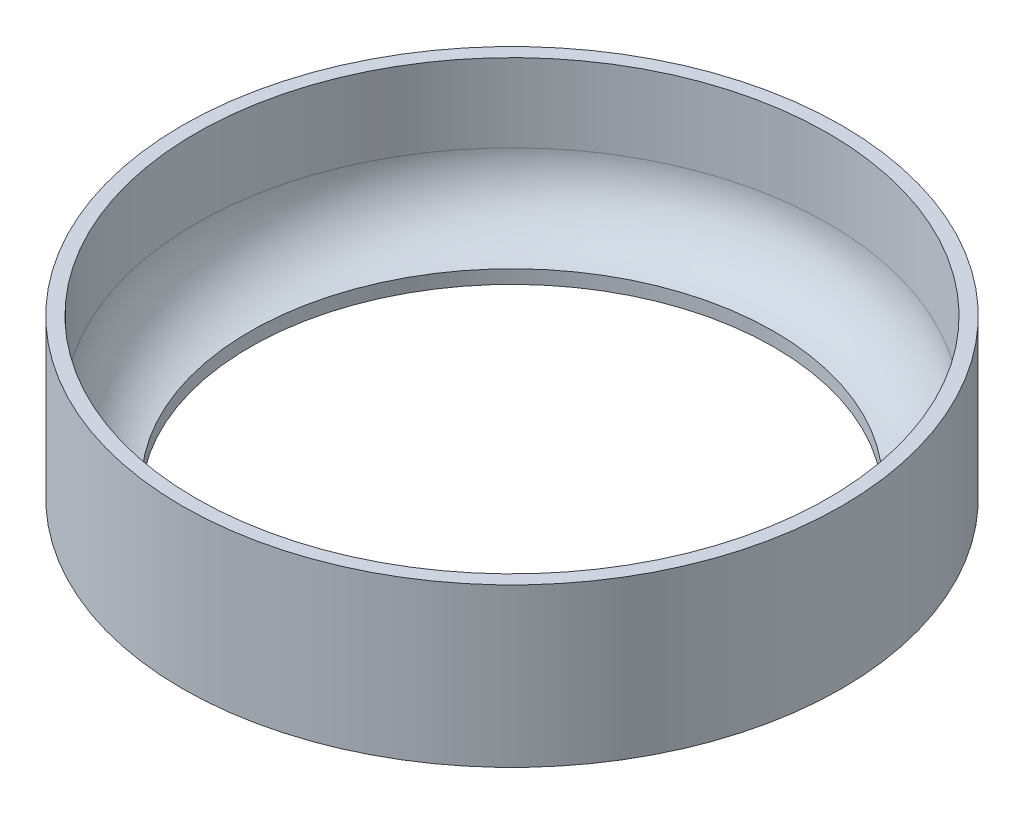
ISO-10303-21;
HEADER;
FILE_DESCRIPTION(('STEP AP214'),'2;1');
FILE_NAME('part.step','',(''),(''),'','','');
FILE_SCHEMA(('AUTOMOTIVE_DESIGN { 1 0 10303 214 1 1 1 1 }'));
ENDSEC;
DATA;
#1=APPLICATION_CONTEXT('core data for automotive mechanical design processes');
#2=APPLICATION_PROTOCOL_DEFINITION('international standard','automotive_design',2000,#1);
#3=PRODUCT_CONTEXT('',#1,'mechanical');
#4=PRODUCT('Part','Part','',(#3));
#5=PRODUCT_RELATED_PRODUCT_CATEGORY('part','',(#4));
#6=PRODUCT_DEFINITION_FORMATION('','',#4);
#7=PRODUCT_DEFINITION_CONTEXT('part definition',#1,'design');
#8=PRODUCT_DEFINITION('design','',#6,#7);
#9=PRODUCT_DEFINITION_SHAPE('','',#8);
#10=(LENGTH_UNIT() NAMED_UNIT(*) SI_UNIT(.MILLI.,.METRE.));
#11=(NAMED_UNIT(*) PLANE_ANGLE_UNIT() SI_UNIT($,.RADIAN.));
#12=(NAMED_UNIT(*) SI_UNIT($,.STERADIAN.) SOLID_ANGLE_UNIT());
#13=UNCERTAINTY_MEASURE_WITH_UNIT(LENGTH_MEASURE(1.E-05),#10,'distance_accuracy_value','');
#14=(GEOMETRIC_REPRESENTATION_CONTEXT(3) GLOBAL_UNCERTAINTY_ASSIGNED_CONTEXT((#13)) GLOBAL_UNIT_ASSIGNED_CONTEXT((#10,
#11,#12)) REPRESENTATION_CONTEXT('',''));
#15=CARTESIAN_POINT('',(0.,0.,0.));
#16=DIRECTION('',(0.,0.,1.));
#17=DIRECTION('',(1.,0.,0.));
#18=AXIS2_PLACEMENT_3D('',#15,#16,#17);
#19=CARTESIAN_POINT('',(70.,35.,0.));
#20=DIRECTION('',(0.,1.,0.));
#21=DIRECTION('',(0.,0.,1.));
#22=AXIS2_PLACEMENT_3D('',#19,#20,#21);
#23=PLANE('',#22);
#24=CARTESIAN_POINT('',(0.,35.,0.));
#25=DIRECTION('',(0.,-1.,0.));
#26=DIRECTION('',(0.,0.,-1.));
#27=AXIS2_PLACEMENT_3D('',#24,#25,#26);
#28=CIRCLE('',#27,70.);
#29=CARTESIAN_POINT('',(0.,35.,-70.));
#30=VERTEX_POINT('',#29);
#31=EDGE_CURVE('E58',#30,#30,#28,.T.);
#32=ORIENTED_EDGE('',*,*,#31,.T.);
#33=EDGE_LOOP('',(#32));
#34=FACE_BOUND('',#33,.T.);
#35=CARTESIAN_POINT('',(0.,35.,0.));
#36=DIRECTION('',(0.,-1.,0.));
#37=DIRECTION('',(0.,0.,-1.));
#38=AXIS2_PLACEMENT_3D('',#35,#36,#37);
#39=CIRCLE('',#38,73.);
#40=CARTESIAN_POINT('',(0.,35.,-73.));
#41=VERTEX_POINT('',#40);
#42=EDGE_CURVE('E42',#41,#41,#39,.T.);
#43=ORIENTED_EDGE('',*,*,#42,.F.);
#44=EDGE_LOOP('',(#43));
#45=FACE_BOUND('',#44,.T.);
#46=ADVANCED_FACE('F35',(#34,#45),#23,.T.);
#47=CARTESIAN_POINT('',(0.,0.,0.));
#48=DIRECTION('',(0.,-1.,0.));
#49=DIRECTION('',(0.,0.,-1.));
#50=AXIS2_PLACEMENT_3D('',#47,#48,#49);
#51=CYLINDRICAL_SURFACE('',#50,73.);
#52=ORIENTED_EDGE('',*,*,#42,.T.);
#53=EDGE_LOOP('',(#52));
#54=FACE_BOUND('',#53,.T.);
#55=CARTESIAN_POINT('',(0.,0.,0.));
#56=DIRECTION('',(0.,-1.,0.));
#57=DIRECTION('',(0.,0.,-1.));
#58=AXIS2_PLACEMENT_3D('',#55,#56,#57);
#59=CIRCLE('',#58,73.);
#60=CARTESIAN_POINT('',(0.,0.,-73.));
#61=VERTEX_POINT('',#60);
#62=EDGE_CURVE('E46',#61,#61,#59,.T.);
#63=ORIENTED_EDGE('',*,*,#62,.F.);
#64=EDGE_LOOP('',(#63));
#65=FACE_BOUND('',#64,.T.);
#66=ADVANCED_FACE('F77',(#54,#65),#51,.T.);
#67=CARTESIAN_POINT('',(73.,0.,0.));
#68=DIRECTION('',(0.,-1.,0.));
#69=DIRECTION('',(0.,0.,-1.));
#70=AXIS2_PLACEMENT_3D('',#67,#68,#69);
#71=PLANE('',#70);
#72=ORIENTED_EDGE('',*,*,#62,.T.);
#73=EDGE_LOOP('',(#72));
#74=FACE_BOUND('',#73,.T.);
#75=CARTESIAN_POINT('',(0.,0.,0.));
#76=DIRECTION('',(0.,-1.,0.));
#77=DIRECTION('',(0.,0.,-1.));
#78=AXIS2_PLACEMENT_3D('',#75,#76,#77);
#79=CIRCLE('',#78,58.);
#80=CARTESIAN_POINT('',(0.,0.,-58.));
#81=VERTEX_POINT('',#80);
#82=EDGE_CURVE('E50',#81,#81,#79,.T.);
#83=ORIENTED_EDGE('',*,*,#82,.F.);
#84=EDGE_LOOP('',(#83));
#85=FACE_BOUND('',#84,.T.);
#86=ADVANCED_FACE('F73',(#74,#85),#71,.T.);
#87=CARTESIAN_POINT('',(0.,0.,0.));
#88=DIRECTION('',(0.,-1.,0.));
#89=DIRECTION('',(0.,0.,-1.));
#90=AXIS2_PLACEMENT_3D('',#87,#88,#89);
#91=CYLINDRICAL_SURFACE('',#90,58.);
#92=ORIENTED_EDGE('',*,*,#82,.T.);
#93=EDGE_LOOP('',(#92));
#94=FACE_BOUND('',#93,.T.);
#95=CARTESIAN_POINT('',(0.,3.,0.));
#96=DIRECTION('',(0.,-1.,0.));
#97=DIRECTION('',(0.,0.,-1.));
#98=AXIS2_PLACEMENT_3D('',#95,#96,#97);
#99=CIRCLE('',#98,58.);
#100=CARTESIAN_POINT('',(0.,3.,-58.));
#101=VERTEX_POINT('',#100);
#102=EDGE_CURVE('E55',#101,#101,#99,.T.);
#103=ORIENTED_EDGE('',*,*,#102,.F.);
#104=EDGE_LOOP('',(#103));
#105=FACE_BOUND('',#104,.T.);
#106=ADVANCED_FACE('F66',(#94,#105),#91,.F.);
#107=CARTESIAN_POINT('',(0.,0.,0.));
#108=DIRECTION('',(0.,-1.,0.));
#109=DIRECTION('',(0.,0.,-1.));
#110=AXIS2_PLACEMENT_3D('',#107,#108,#109);
#111=CYLINDRICAL_SURFACE('',#110,70.);
#112=CARTESIAN_POINT('',(0.,17.6969384566991,0.));
#113=DIRECTION('',(0.,-1.,0.));
#114=DIRECTION('',(0.,0.,-1.));
#115=AXIS2_PLACEMENT_3D('',#112,#113,#114);
#116=CIRCLE('',#115,70.);
#117=CARTESIAN_POINT('',(0.,17.6969384566991,-70.));
#118=VERTEX_POINT('',#117);
#119=EDGE_CURVE('E10',#118,#118,#116,.T.);
#120=ORIENTED_EDGE('',*,*,#119,.T.);
#121=EDGE_LOOP('',(#120));
#122=FACE_BOUND('',#121,.T.);
#123=ORIENTED_EDGE('',*,*,#31,.F.);
#124=EDGE_LOOP('',(#123));
#125=FACE_BOUND('',#124,.T.);
#126=ADVANCED_FACE('F64',(#122,#125),#111,.F.);
#127=CARTESIAN_POINT('',(0.,17.6969384566991,0.));
#128=DIRECTION('',(0.,-1.,0.));
#129=DIRECTION('',(0.,0.,-1.));
#130=AXIS2_PLACEMENT_3D('',#127,#128,#129);
#131=TOROIDAL_SURFACE('',#130,55.,15.);
#132=ORIENTED_EDGE('',*,*,#102,.T.);
#133=EDGE_LOOP('',(#132));
#134=FACE_BOUND('',#133,.T.);
#135=ORIENTED_EDGE('',*,*,#119,.F.);
#136=EDGE_LOOP('',(#135));
#137=FACE_BOUND('',#136,.T.);
#138=ADVANCED_FACE('F37',(#134,#137),#131,.F.);
#139=CLOSED_SHELL('',(#46,#66,#86,#106,#126,#138));
#140=MANIFOLD_SOLID_BREP('B2',#139);
#141=ADVANCED_BREP_SHAPE_REPRESENTATION('',(#18,#140),#14);
#142=SHAPE_DEFINITION_REPRESENTATION(#9,#141);
ENDSEC;
END-ISO-10303-21;
